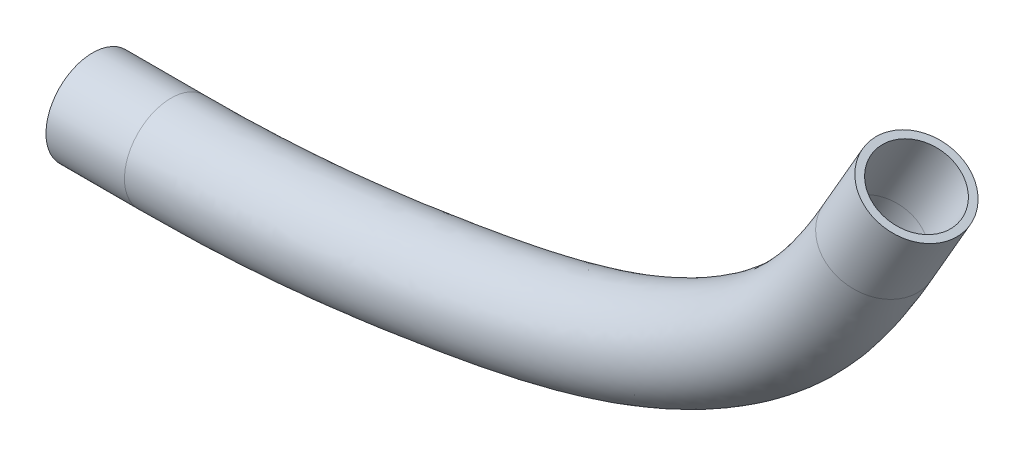
ISO-10303-21;
HEADER;
FILE_DESCRIPTION(('STEP AP214'),'2;1');
FILE_NAME('part.step','',(''),(''),'','','');
FILE_SCHEMA(('AUTOMOTIVE_DESIGN { 1 0 10303 214 1 1 1 1 }'));
ENDSEC;
DATA;
#1=APPLICATION_CONTEXT('core data for automotive mechanical design processes');
#2=APPLICATION_PROTOCOL_DEFINITION('international standard','automotive_design',2000,#1);
#3=PRODUCT_CONTEXT('',#1,'mechanical');
#4=PRODUCT('Part','Part','',(#3));
#5=PRODUCT_RELATED_PRODUCT_CATEGORY('part','',(#4));
#6=PRODUCT_DEFINITION_FORMATION('','',#4);
#7=PRODUCT_DEFINITION_CONTEXT('part definition',#1,'design');
#8=PRODUCT_DEFINITION('design','',#6,#7);
#9=PRODUCT_DEFINITION_SHAPE('','',#8);
#10=(LENGTH_UNIT() NAMED_UNIT(*) SI_UNIT(.MILLI.,.METRE.));
#11=(NAMED_UNIT(*) PLANE_ANGLE_UNIT() SI_UNIT($,.RADIAN.));
#12=(NAMED_UNIT(*) SI_UNIT($,.STERADIAN.) SOLID_ANGLE_UNIT());
#13=UNCERTAINTY_MEASURE_WITH_UNIT(LENGTH_MEASURE(1.E-05),#10,'distance_accuracy_value','');
#14=(GEOMETRIC_REPRESENTATION_CONTEXT(3) GLOBAL_UNCERTAINTY_ASSIGNED_CONTEXT((#13)) GLOBAL_UNIT_ASSIGNED_CONTEXT((#10,
#11,#12)) REPRESENTATION_CONTEXT('',''));
#15=CARTESIAN_POINT('',(0.,0.,0.));
#16=DIRECTION('',(0.,0.,1.));
#17=DIRECTION('',(1.,0.,0.));
#18=AXIS2_PLACEMENT_3D('',#15,#16,#17);
#19=CARTESIAN_POINT('',(228.6,88.9000000000001,0.));
#20=DIRECTION('',(0.500000000000005,0.866025403784436,0.));
#21=DIRECTION('',(-0.866025403784436,0.500000000000005,0.));
#22=AXIS2_PLACEMENT_3D('',#19,#20,#21);
#23=CYLINDRICAL_SURFACE('',#22,15.08125);
#24=CARTESIAN_POINT('',(228.6,88.9000000000001,0.));
#25=DIRECTION('',(-0.500000000000005,-0.866025403784436,0.));
#26=DIRECTION('',(0.866025403784436,-0.500000000000005,0.));
#27=AXIS2_PLACEMENT_3D('',#24,#25,#26);
#28=CIRCLE('',#27,15.08125);
#29=CARTESIAN_POINT('',(215.539254379176,96.4406250000001,0.));
#30=VERTEX_POINT('',#29);
#31=EDGE_CURVE('E99',#30,#30,#28,.T.);
#32=CARTESIAN_POINT('',(241.3,110.897045256125,0.));
#33=DIRECTION('',(-0.500000000000005,-0.866025403784436,0.));
#34=DIRECTION('',(0.866025403784436,-0.500000000000005,0.));
#35=AXIS2_PLACEMENT_3D('',#32,#33,#34);
#36=CIRCLE('',#35,15.08125);
#37=CARTESIAN_POINT('',(228.239254379176,118.437670256125,0.));
#38=VERTEX_POINT('',#37);
#39=EDGE_CURVE('E11',#38,#38,#36,.T.);
#40=CARTESIAN_POINT('',(215.539254379176,96.4406250000001,0.));
#41=CARTESIAN_POINT('',(215.671546045843,96.6697608880848,0.));
#42=CARTESIAN_POINT('',(215.803837712509,96.8988967761694,0.));
#43=CARTESIAN_POINT('',(216.068421045843,97.3571685523387,0.));
#44=CARTESIAN_POINT('',(216.200712712509,97.5863044404233,0.));
#45=CARTESIAN_POINT('',(216.465296045843,98.0445762165926,0.));
#46=CARTESIAN_POINT('',(216.597587712509,98.2737121046772,0.));
#47=CARTESIAN_POINT('',(216.862171045843,98.7319838808465,0.));
#48=CARTESIAN_POINT('',(216.994462712509,98.9611197689311,0.));
#49=CARTESIAN_POINT('',(217.259046045843,99.4193915451004,0.));
#50=CARTESIAN_POINT('',(217.391337712509,99.648527433185,0.));
#51=CARTESIAN_POINT('',(217.655921045843,100.106799209354,0.));
#52=CARTESIAN_POINT('',(217.788212712509,100.335935097439,0.));
#53=CARTESIAN_POINT('',(218.052796045843,100.794206873608,0.));
#54=CARTESIAN_POINT('',(218.185087712509,101.023342761693,0.));
#55=CARTESIAN_POINT('',(218.449671045843,101.481614537862,0.));
#56=CARTESIAN_POINT('',(218.581962712509,101.710750425947,0.));
#57=CARTESIAN_POINT('',(218.846546045843,102.169022202116,0.));
#58=CARTESIAN_POINT('',(218.978837712509,102.398158090201,0.));
#59=CARTESIAN_POINT('',(219.243421045843,102.85642986637,0.));
#60=CARTESIAN_POINT('',(219.375712712509,103.085565754454,0.));
#61=CARTESIAN_POINT('',(219.640296045843,103.543837530624,0.));
#62=CARTESIAN_POINT('',(219.772587712509,103.772973418708,0.));
#63=CARTESIAN_POINT('',(220.037171045843,104.231245194878,0.));
#64=CARTESIAN_POINT('',(220.169462712509,104.460381082962,0.));
#65=CARTESIAN_POINT('',(220.434046045843,104.918652859132,0.));
#66=CARTESIAN_POINT('',(220.566337712509,105.147788747216,0.));
#67=CARTESIAN_POINT('',(220.830921045843,105.606060523385,0.));
#68=CARTESIAN_POINT('',(220.963212712509,105.83519641147,0.));
#69=CARTESIAN_POINT('',(221.227796045843,106.293468187639,0.));
#70=CARTESIAN_POINT('',(221.360087712509,106.522604075724,0.));
#71=CARTESIAN_POINT('',(221.624671045843,106.980875851893,0.));
#72=CARTESIAN_POINT('',(221.756962712509,107.210011739978,0.));
#73=CARTESIAN_POINT('',(222.021546045843,107.668283516147,0.));
#74=CARTESIAN_POINT('',(222.153837712509,107.897419404232,0.));
#75=CARTESIAN_POINT('',(222.418421045843,108.355691180401,0.));
#76=CARTESIAN_POINT('',(222.550712712509,108.584827068486,0.));
#77=CARTESIAN_POINT('',(222.815296045843,109.043098844655,0.));
#78=CARTESIAN_POINT('',(222.947587712509,109.27223473274,0.));
#79=CARTESIAN_POINT('',(223.212171045843,109.730506508909,0.));
#80=CARTESIAN_POINT('',(223.344462712509,109.959642396993,0.));
#81=CARTESIAN_POINT('',(223.609046045843,110.417914173163,0.));
#82=CARTESIAN_POINT('',(223.741337712509,110.647050061247,0.));
#83=CARTESIAN_POINT('',(224.005921045843,111.105321837417,0.));
#84=CARTESIAN_POINT('',(224.138212712509,111.334457725501,0.));
#85=CARTESIAN_POINT('',(224.402796045843,111.79272950167,0.));
#86=CARTESIAN_POINT('',(224.535087712509,112.021865389755,0.));
#87=CARTESIAN_POINT('',(224.799671045843,112.480137165924,0.));
#88=CARTESIAN_POINT('',(224.931962712509,112.709273054009,0.));
#89=CARTESIAN_POINT('',(225.196546045843,113.167544830178,0.));
#90=CARTESIAN_POINT('',(225.328837712509,113.396680718263,0.));
#91=CARTESIAN_POINT('',(225.593421045843,113.854952494432,0.));
#92=CARTESIAN_POINT('',(225.725712712509,114.084088382517,0.));
#93=CARTESIAN_POINT('',(225.990296045843,114.542360158686,0.));
#94=CARTESIAN_POINT('',(226.122587712509,114.771496046771,0.));
#95=CARTESIAN_POINT('',(226.387171045843,115.22976782294,0.));
#96=CARTESIAN_POINT('',(226.519462712509,115.458903711025,0.));
#97=CARTESIAN_POINT('',(226.784046045843,115.917175487194,0.));
#98=CARTESIAN_POINT('',(226.916337712509,116.146311375278,0.));
#99=CARTESIAN_POINT('',(227.180921045843,116.604583151448,0.));
#100=CARTESIAN_POINT('',(227.313212712509,116.833719039532,0.));
#101=CARTESIAN_POINT('',(227.577796045843,117.291990815702,0.));
#102=CARTESIAN_POINT('',(227.710087712509,117.521126703786,0.));
#103=CARTESIAN_POINT('',(227.974671045843,117.979398479956,0.));
#104=CARTESIAN_POINT('',(228.106962712509,118.20853436804,0.));
#105=CARTESIAN_POINT('',(228.239254379176,118.437670256125,0.));
#106=B_SPLINE_CURVE_WITH_KNOTS('',3,(#40,#41,#42,#43,#44,#45,#46,#47,#48,#49,#50,#51,#52,#53,
#54,#55,#56,#57,#58,#59,#60,#61,#62,#63,#64,#65,#66,#67,#68,#69,#70,#71,#72,#73,#74,#75,#76,#77,
#78,#79,#80,#81,#82,#83,#84,#85,#86,#87,#88,#89,#90,#91,#92,#93,#94,#95,#96,#97,#98,#99,#100,
#101,#102,#103,#104,#105),.UNSPECIFIED.,.F.,.F.,(4,2,2,2,2,2,2,2,2,2,2,2,2,2,2,2,2,2,2,2,2,2,2,
2,2,2,2,2,2,2,2,2,4),(0.,0.79375,1.58750000000001,2.38125,3.17500000000001,3.96875,
4.76250000000001,5.55625,6.35000000000001,7.14375,7.93750000000002,8.73125,9.525,10.31875,
11.1125,11.90625,12.7,13.49375,14.2875,15.08125,15.875,16.66875,17.4625,18.25625,19.05,19.84375,
20.6375,21.43125,22.225,23.01875,23.8125,24.60625,25.4),.UNSPECIFIED.);
#107=EDGE_CURVE('BSEAM76',#30,#38,#106,.T.);
#108=ORIENTED_EDGE('',*,*,#31,.F.);
#109=ORIENTED_EDGE('',*,*,#39,.T.);
#110=ORIENTED_EDGE('',*,*,#107,.T.);
#111=ORIENTED_EDGE('',*,*,#107,.F.);
#112=EDGE_LOOP('',(#108,#110,#109,#111));
#113=FACE_BOUND('',#112,.T.);
#114=ADVANCED_FACE('F76',(#113),#23,.T.);
#115=CARTESIAN_POINT('',(228.6,88.9000000000001,0.));
#116=DIRECTION('',(0.500000000000005,0.866025403784436,0.));
#117=DIRECTION('',(-0.866025403784436,0.500000000000005,0.));
#118=AXIS2_PLACEMENT_3D('',#115,#116,#117);
#119=CYLINDRICAL_SURFACE('',#118,12.7);
#120=CARTESIAN_POINT('',(228.6,88.9000000000001,0.));
#121=DIRECTION('',(-0.500000000000005,-0.866025403784436,0.));
#122=DIRECTION('',(0.866025403784436,-0.500000000000005,0.));
#123=AXIS2_PLACEMENT_3D('',#120,#121,#122);
#124=CIRCLE('',#123,12.7);
#125=CARTESIAN_POINT('',(217.601477371938,95.2500000000001,0.));
#126=VERTEX_POINT('',#125);
#127=EDGE_CURVE('E102',#126,#126,#124,.T.);
#128=CARTESIAN_POINT('',(241.3,110.897045256125,0.));
#129=DIRECTION('',(-0.500000000000005,-0.866025403784436,0.));
#130=DIRECTION('',(0.866025403784436,-0.500000000000005,0.));
#131=AXIS2_PLACEMENT_3D('',#128,#129,#130);
#132=CIRCLE('',#131,12.7);
#133=CARTESIAN_POINT('',(230.301477371938,117.247045256125,0.));
#134=VERTEX_POINT('',#133);
#135=EDGE_CURVE('E82',#134,#134,#132,.T.);
#136=CARTESIAN_POINT('',(217.601477371938,95.2500000000001,0.));
#137=CARTESIAN_POINT('',(217.733769038604,95.4791358880848,0.));
#138=CARTESIAN_POINT('',(217.866060705271,95.7082717761694,0.));
#139=CARTESIAN_POINT('',(218.130644038604,96.1665435523387,0.));
#140=CARTESIAN_POINT('',(218.262935705271,96.3956794404233,0.));
#141=CARTESIAN_POINT('',(218.527519038604,96.8539512165926,0.));
#142=CARTESIAN_POINT('',(218.659810705271,97.0830871046772,0.));
#143=CARTESIAN_POINT('',(218.924394038604,97.5413588808464,0.));
#144=CARTESIAN_POINT('',(219.056685705271,97.7704947689311,0.));
#145=CARTESIAN_POINT('',(219.321269038604,98.2287665451004,0.));
#146=CARTESIAN_POINT('',(219.453560705271,98.457902433185,0.));
#147=CARTESIAN_POINT('',(219.718144038604,98.9161742093542,0.));
#148=CARTESIAN_POINT('',(219.850435705271,99.1453100974389,0.));
#149=CARTESIAN_POINT('',(220.115019038604,99.6035818736081,0.));
#150=CARTESIAN_POINT('',(220.247310705271,99.8327177616928,0.));
#151=CARTESIAN_POINT('',(220.511894038604,100.290989537862,0.));
#152=CARTESIAN_POINT('',(220.644185705271,100.520125425947,0.));
#153=CARTESIAN_POINT('',(220.908769038604,100.978397202116,0.));
#154=CARTESIAN_POINT('',(221.041060705271,101.207533090201,0.));
#155=CARTESIAN_POINT('',(221.305644038604,101.66580486637,0.));
#156=CARTESIAN_POINT('',(221.437935705271,101.894940754454,0.));
#157=CARTESIAN_POINT('',(221.702519038604,102.353212530624,0.));
#158=CARTESIAN_POINT('',(221.834810705271,102.582348418708,0.));
#159=CARTESIAN_POINT('',(222.099394038604,103.040620194878,0.));
#160=CARTESIAN_POINT('',(222.231685705271,103.269756082962,0.));
#161=CARTESIAN_POINT('',(222.496269038604,103.728027859132,0.));
#162=CARTESIAN_POINT('',(222.628560705271,103.957163747216,0.));
#163=CARTESIAN_POINT('',(222.893144038604,104.415435523385,0.));
#164=CARTESIAN_POINT('',(223.025435705271,104.64457141147,0.));
#165=CARTESIAN_POINT('',(223.290019038604,105.102843187639,0.));
#166=CARTESIAN_POINT('',(223.422310705271,105.331979075724,0.));
#167=CARTESIAN_POINT('',(223.686894038604,105.790250851893,0.));
#168=CARTESIAN_POINT('',(223.819185705271,106.019386739978,0.));
#169=CARTESIAN_POINT('',(224.083769038604,106.477658516147,0.));
#170=CARTESIAN_POINT('',(224.216060705271,106.706794404232,0.));
#171=CARTESIAN_POINT('',(224.480644038604,107.165066180401,0.));
#172=CARTESIAN_POINT('',(224.612935705271,107.394202068486,0.));
#173=CARTESIAN_POINT('',(224.877519038604,107.852473844655,0.));
#174=CARTESIAN_POINT('',(225.009810705271,108.08160973274,0.));
#175=CARTESIAN_POINT('',(225.274394038604,108.539881508909,0.));
#176=CARTESIAN_POINT('',(225.406685705271,108.769017396993,0.));
#177=CARTESIAN_POINT('',(225.671269038604,109.227289173163,0.));
#178=CARTESIAN_POINT('',(225.803560705271,109.456425061247,0.));
#179=CARTESIAN_POINT('',(226.068144038604,109.914696837417,0.));
#180=CARTESIAN_POINT('',(226.200435705271,110.143832725501,0.));
#181=CARTESIAN_POINT('',(226.465019038604,110.60210450167,0.));
#182=CARTESIAN_POINT('',(226.597310705271,110.831240389755,0.));
#183=CARTESIAN_POINT('',(226.861894038604,111.289512165924,0.));
#184=CARTESIAN_POINT('',(226.994185705271,111.518648054009,0.));
#185=CARTESIAN_POINT('',(227.258769038604,111.976919830178,0.));
#186=CARTESIAN_POINT('',(227.391060705271,112.206055718263,0.));
#187=CARTESIAN_POINT('',(227.655644038604,112.664327494432,0.));
#188=CARTESIAN_POINT('',(227.787935705271,112.893463382517,0.));
#189=CARTESIAN_POINT('',(228.052519038604,113.351735158686,0.));
#190=CARTESIAN_POINT('',(228.184810705271,113.580871046771,0.));
#191=CARTESIAN_POINT('',(228.449394038604,114.03914282294,0.));
#192=CARTESIAN_POINT('',(228.581685705271,114.268278711025,0.));
#193=CARTESIAN_POINT('',(228.846269038604,114.726550487194,0.));
#194=CARTESIAN_POINT('',(228.978560705271,114.955686375278,0.));
#195=CARTESIAN_POINT('',(229.243144038604,115.413958151448,0.));
#196=CARTESIAN_POINT('',(229.375435705271,115.643094039532,0.));
#197=CARTESIAN_POINT('',(229.640019038604,116.101365815702,0.));
#198=CARTESIAN_POINT('',(229.772310705271,116.330501703786,0.));
#199=CARTESIAN_POINT('',(230.036894038604,116.788773479956,0.));
#200=CARTESIAN_POINT('',(230.169185705271,117.01790936804,0.));
#201=CARTESIAN_POINT('',(230.301477371938,117.247045256125,0.));
#202=B_SPLINE_CURVE_WITH_KNOTS('',3,(#136,#137,#138,#139,#140,#141,#142,#143,#144,#145,#146,
#147,#148,#149,#150,#151,#152,#153,#154,#155,#156,#157,#158,#159,#160,#161,#162,#163,#164,#165,
#166,#167,#168,#169,#170,#171,#172,#173,#174,#175,#176,#177,#178,#179,#180,#181,#182,#183,#184,
#185,#186,#187,#188,#189,#190,#191,#192,#193,#194,#195,#196,#197,#198,#199,#200,#201),
.UNSPECIFIED.,.F.,.F.,(4,2,2,2,2,2,2,2,2,2,2,2,2,2,2,2,2,2,2,2,2,2,2,2,2,2,2,2,2,2,2,2,4),(0.,
0.793750000000013,1.58750000000001,2.38125000000001,3.17500000000001,3.96875000000002,
4.76250000000002,5.55625,6.35000000000002,7.14375,7.93750000000002,8.73125,9.52500000000002,
10.31875,11.1125,11.90625,12.7,13.49375,14.2875,15.08125,15.875,16.66875,17.4625,18.25625,19.05,
19.84375,20.6375,21.43125,22.225,23.01875,23.8125,24.60625,25.4),.UNSPECIFIED.);
#203=EDGE_CURVE('BSEAM120',#126,#134,#202,.T.);
#204=ORIENTED_EDGE('',*,*,#127,.T.);
#205=ORIENTED_EDGE('',*,*,#135,.F.);
#206=ORIENTED_EDGE('',*,*,#203,.T.);
#207=ORIENTED_EDGE('',*,*,#203,.F.);
#208=EDGE_LOOP('',(#204,#206,#205,#207));
#209=FACE_BOUND('',#208,.T.);
#210=ADVANCED_FACE('F120',(#209),#119,.F.);
#211=CARTESIAN_POINT('',(0.,0.,0.));
#212=DIRECTION('',(-1.,0.,0.));
#213=DIRECTION('',(0.,-1.,0.));
#214=AXIS2_PLACEMENT_3D('',#211,#212,#213);
#215=CYLINDRICAL_SURFACE('',#214,12.7);
#216=CARTESIAN_POINT('',(0.,0.,0.));
#217=DIRECTION('',(-1.,0.,0.));
#218=DIRECTION('',(0.,-1.,0.));
#219=AXIS2_PLACEMENT_3D('',#216,#217,#218);
#220=CIRCLE('',#219,12.7);
#221=CARTESIAN_POINT('',(0.,-12.7,0.));
#222=VERTEX_POINT('',#221);
#223=EDGE_CURVE('E86',#222,#222,#220,.T.);
#224=ORIENTED_EDGE('',*,*,#223,.F.);
#225=EDGE_LOOP('',(#224));
#226=FACE_BOUND('',#225,.T.);
#227=CARTESIAN_POINT('',(-25.4,0.,0.));
#228=DIRECTION('',(-1.,0.,0.));
#229=DIRECTION('',(0.,-1.,0.));
#230=AXIS2_PLACEMENT_3D('',#227,#228,#229);
#231=CIRCLE('',#230,12.7);
#232=CARTESIAN_POINT('',(-25.4,-12.7,0.));
#233=VERTEX_POINT('',#232);
#234=EDGE_CURVE('E95',#233,#233,#231,.T.);
#235=ORIENTED_EDGE('',*,*,#234,.T.);
#236=EDGE_LOOP('',(#235));
#237=FACE_BOUND('',#236,.T.);
#238=ADVANCED_FACE('F124',(#226,#237),#215,.F.);
#239=CARTESIAN_POINT('',(0.,0.,0.));
#240=DIRECTION('',(-1.,0.,0.));
#241=DIRECTION('',(0.,-1.,0.));
#242=AXIS2_PLACEMENT_3D('',#239,#240,#241);
#243=CYLINDRICAL_SURFACE('',#242,15.08125);
#244=CARTESIAN_POINT('',(0.,0.,0.));
#245=DIRECTION('',(-1.,0.,0.));
#246=DIRECTION('',(0.,-1.,0.));
#247=AXIS2_PLACEMENT_3D('',#244,#245,#246);
#248=CIRCLE('',#247,15.08125);
#249=CARTESIAN_POINT('',(0.,-15.08125,0.));
#250=VERTEX_POINT('',#249);
#251=EDGE_CURVE('E97',#250,#250,#248,.T.);
#252=ORIENTED_EDGE('',*,*,#251,.T.);
#253=EDGE_LOOP('',(#252));
#254=FACE_BOUND('',#253,.T.);
#255=CARTESIAN_POINT('',(-25.4,0.,0.));
#256=DIRECTION('',(-1.,0.,0.));
#257=DIRECTION('',(0.,-1.,0.));
#258=AXIS2_PLACEMENT_3D('',#255,#256,#257);
#259=CIRCLE('',#258,15.08125);
#260=CARTESIAN_POINT('',(-25.4,-15.08125,0.));
#261=VERTEX_POINT('',#260);
#262=EDGE_CURVE('E90',#261,#261,#259,.T.);
#263=ORIENTED_EDGE('',*,*,#262,.F.);
#264=EDGE_LOOP('',(#263));
#265=FACE_BOUND('',#264,.T.);
#266=ADVANCED_FACE('F108',(#254,#265),#243,.T.);
#267=CARTESIAN_POINT('',(-25.4,0.,0.));
#268=DIRECTION('',(-1.,0.,0.));
#269=DIRECTION('',(0.,-1.,0.));
#270=AXIS2_PLACEMENT_3D('',#267,#268,#269);
#271=PLANE('',#270);
#272=ORIENTED_EDGE('',*,*,#234,.F.);
#273=EDGE_LOOP('',(#272));
#274=FACE_BOUND('',#273,.T.);
#275=ORIENTED_EDGE('',*,*,#262,.T.);
#276=EDGE_LOOP('',(#275));
#277=FACE_BOUND('',#276,.T.);
#278=ADVANCED_FACE('F135',(#274,#277),#271,.T.);
#279=CARTESIAN_POINT('',(241.3,110.897045256125,0.));
#280=DIRECTION('',(-0.500000000000005,-0.866025403784436,0.));
#281=DIRECTION('',(0.866025403784436,-0.500000000000005,0.));
#282=AXIS2_PLACEMENT_3D('',#279,#280,#281);
#283=PLANE('',#282);
#284=ORIENTED_EDGE('',*,*,#135,.T.);
#285=EDGE_LOOP('',(#284));
#286=FACE_BOUND('',#285,.T.);
#287=ORIENTED_EDGE('',*,*,#39,.F.);
#288=EDGE_LOOP('',(#287));
#289=FACE_BOUND('',#288,.T.);
#290=ADVANCED_FACE('F115',(#286,#289),#283,.F.);
#291=CARTESIAN_POINT('',(0.,-15.08125,0.));
#292=CARTESIAN_POINT('',(18.093431211147,-15.08125,0.));
#293=CARTESIAN_POINT('',(49.9392420784111,-13.3944278860965,0.));
#294=CARTESIAN_POINT('',(80.0631694084453,-9.14945539964788,0.));
#295=CARTESIAN_POINT('',(111.578090255299,-3.90013932534059,0.));
#296=CARTESIAN_POINT('',(133.879045836862,0.651919121229525,0.));
#297=CARTESIAN_POINT('',(160.096131982639,9.95020346990676,0.));
#298=CARTESIAN_POINT('',(179.330164217016,18.4436051873841,0.));
#299=CARTESIAN_POINT('',(196.44367233351,28.972441116401,0.));
#300=CARTESIAN_POINT('',(212.26941229311,41.9785559995121,0.));
#301=CARTESIAN_POINT('',(226.168861768673,56.4789919037061,0.));
#302=CARTESIAN_POINT('',(236.246260228094,71.9812112029525,0.));
#303=CARTESIAN_POINT('',(241.660745620824,81.359375,0.));
#304=CARTESIAN_POINT('',(0.,-15.08125,-30.1625));
#305=CARTESIAN_POINT('',(16.6150789725271,-15.08125,-30.1625));
#306=CARTESIAN_POINT('',(50.4847528081656,-13.3915701600589,-30.1625));
#307=CARTESIAN_POINT('',(80.2027217505945,-9.15496845130661,-30.1625));
#308=CARTESIAN_POINT('',(111.46516577559,-3.89624547701228,-30.1625));
#309=CARTESIAN_POINT('',(133.891308604068,0.678515969095929,-30.1625));
#310=CARTESIAN_POINT('',(160.09160522909,9.92662890568883,-30.1625));
#311=CARTESIAN_POINT('',(179.309061748697,18.4154952854764,-30.1625));
#312=CARTESIAN_POINT('',(196.547852260839,29.1532274254173,-30.1625));
#313=CARTESIAN_POINT('',(212.116756483925,41.7129369425094,-30.1625));
#314=CARTESIAN_POINT('',(225.859085412365,55.9431036139135,-30.1625));
#315=CARTESIAN_POINT('',(237.450326235699,74.0667147037901,-30.1625));
#316=CARTESIAN_POINT('',(241.660745620824,81.359375,-30.1625));
#317=CARTESIAN_POINT('',(0.,15.08125,-30.1625));
#318=CARTESIAN_POINT('',(16.6150789725271,15.08125,-30.1625));
#319=CARTESIAN_POINT('',(46.9604612473906,16.6337705522859,-30.1625));
#320=CARTESIAN_POINT('',(75.9703848872865,20.7308081432165,-30.1625));
#321=CARTESIAN_POINT('',(105.747901194065,25.7186906801474,-30.1625));
#322=CARTESIAN_POINT('',(126.297699937763,29.9947924752805,-30.1625));
#323=CARTESIAN_POINT('',(148.930843491576,37.9677630901454,-30.1625));
#324=CARTESIAN_POINT('',(165.155415435041,45.1627919177847,-30.1625));
#325=CARTESIAN_POINT('',(179.360235967597,54.0724592636084,-30.1625));
#326=CARTESIAN_POINT('',(191.509787197597,63.822161698121,-30.1625));
#327=CARTESIAN_POINT('',(201.848149407904,74.6156698462572,-30.1625));
#328=CARTESIAN_POINT('',(211.328834994051,89.1479647037903,-30.1625));
#329=CARTESIAN_POINT('',(215.539254379176,96.4406250000001,-30.1625));
#330=CARTESIAN_POINT('',(0.,15.08125,0.));
#331=CARTESIAN_POINT('',(17.3542550918371,15.08125,0.));
#332=CARTESIAN_POINT('',(46.6877058825133,16.6323416892671,0.));
#333=CARTESIAN_POINT('',(75.9006087162119,20.7335646690459,0.));
#334=CARTESIAN_POINT('',(105.804363433919,25.7167437559832,0.));
#335=CARTESIAN_POINT('',(126.29156855416,29.9814940513473,0.));
#336=CARTESIAN_POINT('',(148.933106868351,37.9795503722544,0.));
#337=CARTESIAN_POINT('',(165.165966669201,45.1768468687386,0.));
#338=CARTESIAN_POINT('',(179.308146003932,53.9820661091003,0.));
#339=CARTESIAN_POINT('',(191.58611510219,63.9549712266223,0.));
#340=CARTESIAN_POINT('',(202.003037586058,74.8836139911535,0.));
#341=CARTESIAN_POINT('',(210.726801990248,88.1052129533714,0.));
#342=CARTESIAN_POINT('',(215.539254379176,96.4406250000001,0.));
#343=CARTESIAN_POINT('',(0.,15.08125,30.1625));
#344=CARTESIAN_POINT('',(18.093431211147,15.08125,30.1625));
#345=CARTESIAN_POINT('',(46.4149505176361,16.6309128262484,30.1625));
#346=CARTESIAN_POINT('',(75.8308325451373,20.7363211948753,30.1625));
#347=CARTESIAN_POINT('',(105.860825673773,25.7147968318191,30.1625));
#348=CARTESIAN_POINT('',(126.285437170558,29.9681956274141,30.1625));
#349=CARTESIAN_POINT('',(148.935370245125,37.9913376543634,30.1625));
#350=CARTESIAN_POINT('',(165.176517903361,45.1909018196924,30.1625));
#351=CARTESIAN_POINT('',(179.256056040268,53.8916729545922,30.1625));
#352=CARTESIAN_POINT('',(191.662443006782,64.0877807551237,30.1625));
#353=CARTESIAN_POINT('',(202.157925764212,75.1515581360498,30.1625));
#354=CARTESIAN_POINT('',(210.124768986446,87.0624612029527,30.1625));
#355=CARTESIAN_POINT('',(215.539254379176,96.4406250000001,30.1625));
#356=CARTESIAN_POINT('',(0.,-15.08125,30.1625));
#357=CARTESIAN_POINT('',(19.5717834497669,-15.08125,30.1625));
#358=CARTESIAN_POINT('',(49.3937313486567,-13.397285612134,30.1625));
#359=CARTESIAN_POINT('',(79.9236170662962,-9.14394234798914,30.1625));
#360=CARTESIAN_POINT('',(111.691014735007,-3.90403317366889,30.1625));
#361=CARTESIAN_POINT('',(133.866783069657,0.625322273363133,30.1625));
#362=CARTESIAN_POINT('',(160.100658736188,9.9737780341247,30.1625));
#363=CARTESIAN_POINT('',(179.351266685336,18.4717150892918,30.1625));
#364=CARTESIAN_POINT('',(196.339492406181,28.7916548073848,30.1625));
#365=CARTESIAN_POINT('',(212.422068102295,42.2441750565147,30.1625));
#366=CARTESIAN_POINT('',(226.478638124981,57.0148801934986,30.1625));
#367=CARTESIAN_POINT('',(235.04219422049,69.8957077021149,30.1625));
#368=CARTESIAN_POINT('',(241.660745620824,81.359375,30.1625));
#369=CARTESIAN_POINT('',(0.,-15.08125,0.));
#370=CARTESIAN_POINT('',(18.093431211147,-15.08125,0.));
#371=CARTESIAN_POINT('',(49.9392420784111,-13.3944278860965,0.));
#372=CARTESIAN_POINT('',(80.0631694084453,-9.14945539964788,0.));
#373=CARTESIAN_POINT('',(111.578090255299,-3.90013932534059,0.));
#374=CARTESIAN_POINT('',(133.879045836862,0.651919121229525,0.));
#375=CARTESIAN_POINT('',(160.096131982639,9.95020346990676,0.));
#376=CARTESIAN_POINT('',(179.330164217016,18.4436051873841,0.));
#377=CARTESIAN_POINT('',(196.44367233351,28.972441116401,0.));
#378=CARTESIAN_POINT('',(212.26941229311,41.9785559995121,0.));
#379=CARTESIAN_POINT('',(226.168861768673,56.4789919037061,0.));
#380=CARTESIAN_POINT('',(236.246260228094,71.9812112029525,0.));
#381=CARTESIAN_POINT('',(241.660745620824,81.359375,0.));
#382=(BOUNDED_SURFACE() B_SPLINE_SURFACE(3,3,((#291,#292,#293,#294,#295,#296,#297,#298,#299,
#300,#301,#302,#303),(#304,#305,#306,#307,#308,#309,#310,#311,#312,#313,#314,#315,#316),(#317,
#318,#319,#320,#321,#322,#323,#324,#325,#326,#327,#328,#329),(#330,#331,#332,#333,#334,#335,
#336,#337,#338,#339,#340,#341,#342),(#343,#344,#345,#346,#347,#348,#349,#350,#351,#352,#353,
#354,#355),(#356,#357,#358,#359,#360,#361,#362,#363,#364,#365,#366,#367,#368),(#369,#370,#371,
#372,#373,#374,#375,#376,#377,#378,#379,#380,#381)),.UNSPECIFIED.,.T.,.F.,
.F.) B_SPLINE_SURFACE_WITH_KNOTS((4,3,4),(4,1,1,1,1,1,1,1,1,1,4),(0.,0.5,1.),(0.,
0.186666666666667,0.348640621046122,0.373333333333337,0.56,0.600436112688898,0.67,0.78,
0.811119742450717,0.89,1.),
.UNSPECIFIED.) GEOMETRIC_REPRESENTATION_ITEM() RATIONAL_B_SPLINE_SURFACE(((1.,1.,1.,1.,1.,1.,1.,
1.,1.,1.,1.,1.,1.),(0.333333333333333,0.333333333333333,0.333333333333333,0.333333333333333,
0.333333333333333,0.333333333333333,0.333333333333333,0.333333333333333,0.333333333333333,
0.333333333333333,0.333333333333333,0.333333333333333,0.333333333333333),(0.333333333333333,
0.333333333333333,0.333333333333333,0.333333333333333,0.333333333333333,0.333333333333333,
0.333333333333333,0.333333333333333,0.333333333333333,0.333333333333333,0.333333333333333,
0.333333333333333,0.333333333333333),(1.,1.,1.,1.,1.,1.,1.,1.,1.,1.,1.,1.,1.),
(0.333333333333333,0.333333333333333,0.333333333333333,0.333333333333333,0.333333333333333,
0.333333333333333,0.333333333333333,0.333333333333333,0.333333333333333,0.333333333333333,
0.333333333333333,0.333333333333333,0.333333333333333),(0.333333333333333,0.333333333333333,
0.333333333333333,0.333333333333333,0.333333333333333,0.333333333333333,0.333333333333333,
0.333333333333333,0.333333333333333,0.333333333333333,0.333333333333333,0.333333333333333,
0.333333333333333),(1.,1.,1.,1.,1.,1.,1.,1.,1.,1.,1.,1.,1.))) REPRESENTATION_ITEM('') SURFACE());
#383=ORIENTED_EDGE('',*,*,#251,.F.);
#384=EDGE_LOOP('',(#383));
#385=FACE_BOUND('',#384,.T.);
#386=ORIENTED_EDGE('',*,*,#31,.T.);
#387=EDGE_LOOP('',(#386));
#388=FACE_BOUND('',#387,.T.);
#389=ADVANCED_FACE('F111',(#385,#388),#382,.T.);
#390=CARTESIAN_POINT('',(0.,-12.7,0.));
#391=CARTESIAN_POINT('',(18.0934312090011,-12.7,0.));
#392=CARTESIAN_POINT('',(49.6610085358262,-11.0240062493571,0.));
#393=CARTESIAN_POINT('',(79.7290375492918,-6.79005198728915,0.));
#394=CARTESIAN_POINT('',(111.126727263076,-1.56211804765762,0.));
#395=CARTESIAN_POINT('',(133.279550424185,2.96636201776183,0.));
#396=CARTESIAN_POINT('',(159.215019206499,12.1639772084898,0.));
#397=CARTESIAN_POINT('',(178.212771078157,20.5552338535941,0.));
#398=CARTESIAN_POINT('',(195.086755314495,30.9397489914237,0.));
#399=CARTESIAN_POINT('',(210.642546213417,43.7240209673362,0.));
#400=CARTESIAN_POINT('',(224.273261389525,57.9531415779664,0.));
#401=CARTESIAN_POINT('',(234.184037890182,73.1718373371855,0.));
#402=CARTESIAN_POINT('',(239.598522628062,82.55,0.));
#403=CARTESIAN_POINT('',(0.,-12.7,-25.4));
#404=CARTESIAN_POINT('',(16.8485030078968,-12.7,-25.4));
#405=CARTESIAN_POINT('',(50.1203859927064,-11.0215997428989,-25.4));
#406=CARTESIAN_POINT('',(79.8465553107593,-6.79469455772703,-25.4));
#407=CARTESIAN_POINT('',(111.031632964614,-1.55883901704852,-25.4));
#408=CARTESIAN_POINT('',(133.289876966716,2.98875936632463,-25.4));
#409=CARTESIAN_POINT('',(159.211207201981,12.1441249412341,-25.4));
#410=CARTESIAN_POINT('',(178.195000576694,20.5315623540895,-25.4));
#411=CARTESIAN_POINT('',(195.174485791352,31.0919901140845,-25.4));
#412=CARTESIAN_POINT('',(210.513993935804,43.5003417315675,-25.4));
#413=CARTESIAN_POINT('',(224.012397054681,57.501867168401,-25.4));
#414=CARTESIAN_POINT('',(235.197988347785,74.9280510461121,-25.4));
#415=CARTESIAN_POINT('',(239.598522628062,82.55,-25.4));
#416=CARTESIAN_POINT('',(0.,12.7,-25.4));
#417=CARTESIAN_POINT('',(16.8485030078968,12.7,-25.4));
#418=CARTESIAN_POINT('',(47.1525615204748,14.2628976990757,-25.4));
#419=CARTESIAN_POINT('',(76.2824821627104,18.3722752060819,-25.4));
#420=CARTESIAN_POINT('',(106.217094369645,23.3800545889807,-25.4));
#421=CARTESIAN_POINT('',(126.89525914246,27.6761501083748,-25.4));
#422=CARTESIAN_POINT('',(149.812671001969,35.7577116228817,-25.4));
#423=CARTESIAN_POINT('',(166.276140523089,43.0556016234018,-25.4));
#424=CARTESIAN_POINT('',(180.700703649674,52.0766063988771,-25.4));
#425=CARTESIAN_POINT('',(193.160756642055,62.1186362626089,-25.4));
#426=CARTESIAN_POINT('',(203.792661471977,73.2261334693221,-25.4));
#427=CARTESIAN_POINT('',(213.200943091661,87.6280510461123,-25.4));
#428=CARTESIAN_POINT('',(217.601477371938,95.2500000000001,-25.4));
#429=CARTESIAN_POINT('',(0.,12.7,0.));
#430=CARTESIAN_POINT('',(17.470967108449,12.7,0.));
#431=CARTESIAN_POINT('',(46.9228727920347,14.2616944458466,0.));
#432=CARTESIAN_POINT('',(76.2237232819767,18.3745964913009,0.));
#433=CARTESIAN_POINT('',(106.264641518876,23.3784150736761,0.));
#434=CARTESIAN_POINT('',(126.890095871194,27.6649514340934,0.));
#435=CARTESIAN_POINT('',(149.814577004228,35.7676377565096,0.));
#436=CARTESIAN_POINT('',(166.285025773821,43.0674373731541,0.));
#437=CARTESIAN_POINT('',(180.656838411246,52.0004858375467,0.));
#438=CARTESIAN_POINT('',(193.225032780861,62.2304758804932,0.));
#439=CARTESIAN_POINT('',(203.923093639399,73.4517706741048,0.));
#440=CARTESIAN_POINT('',(212.693967862859,86.7499441916489,0.));
#441=CARTESIAN_POINT('',(217.601477371938,95.2500000000001,0.));
#442=CARTESIAN_POINT('',(0.,12.7,25.4));
#443=CARTESIAN_POINT('',(18.0934312090011,12.7,25.4));
#444=CARTESIAN_POINT('',(46.6931840635946,14.2604911926175,25.4));
#445=CARTESIAN_POINT('',(76.164964401243,18.3769177765198,25.4));
#446=CARTESIAN_POINT('',(106.312188668107,23.3767755583715,25.4));
#447=CARTESIAN_POINT('',(126.884932599929,27.653752759812,25.4));
#448=CARTESIAN_POINT('',(149.816483006487,35.7775638901375,25.4));
#449=CARTESIAN_POINT('',(166.293911024553,43.0792731229064,25.4));
#450=CARTESIAN_POINT('',(180.612973172817,51.9243652762163,25.4));
#451=CARTESIAN_POINT('',(193.289308919668,62.3423154983775,25.4));
#452=CARTESIAN_POINT('',(204.053525806821,73.6774078788874,25.4));
#453=CARTESIAN_POINT('',(212.186992634058,85.8718373371857,25.4));
#454=CARTESIAN_POINT('',(217.601477371938,95.2500000000001,25.4));
#455=CARTESIAN_POINT('',(0.,-12.7,25.4));
#456=CARTESIAN_POINT('',(19.3383594101054,-12.7,25.4));
#457=CARTESIAN_POINT('',(49.201631078946,-11.0264127558154,25.4));
#458=CARTESIAN_POINT('',(79.6115197878244,-6.78540941685126,25.4));
#459=CARTESIAN_POINT('',(111.221821561537,-1.56539707826673,25.4));
#460=CARTESIAN_POINT('',(133.269223881654,2.94396466919903,25.4));
#461=CARTESIAN_POINT('',(159.218831211017,12.1838294757456,25.4));
#462=CARTESIAN_POINT('',(178.230541579621,20.5789053530987,25.4));
#463=CARTESIAN_POINT('',(194.999024837637,30.7875078687629,25.4));
#464=CARTESIAN_POINT('',(210.77109849103,43.9477002031048,25.4));
#465=CARTESIAN_POINT('',(224.534125724368,58.4044159875317,25.4));
#466=CARTESIAN_POINT('',(233.170087432579,71.4156236282588,25.4));
#467=CARTESIAN_POINT('',(239.598522628062,82.55,25.4));
#468=CARTESIAN_POINT('',(0.,-12.7,0.));
#469=CARTESIAN_POINT('',(18.0934312090011,-12.7,0.));
#470=CARTESIAN_POINT('',(49.6610085358262,-11.0240062493571,0.));
#471=CARTESIAN_POINT('',(79.7290375492918,-6.79005198728915,0.));
#472=CARTESIAN_POINT('',(111.126727263076,-1.56211804765762,0.));
#473=CARTESIAN_POINT('',(133.279550424185,2.96636201776183,0.));
#474=CARTESIAN_POINT('',(159.215019206499,12.1639772084898,0.));
#475=CARTESIAN_POINT('',(178.212771078157,20.5552338535941,0.));
#476=CARTESIAN_POINT('',(195.086755314495,30.9397489914237,0.));
#477=CARTESIAN_POINT('',(210.642546213417,43.7240209673362,0.));
#478=CARTESIAN_POINT('',(224.273261389525,57.9531415779664,0.));
#479=CARTESIAN_POINT('',(234.184037890182,73.1718373371855,0.));
#480=CARTESIAN_POINT('',(239.598522628062,82.55,0.));
#481=(BOUNDED_SURFACE() B_SPLINE_SURFACE(3,3,((#390,#391,#392,#393,#394,#395,#396,#397,#398,
#399,#400,#401,#402),(#403,#404,#405,#406,#407,#408,#409,#410,#411,#412,#413,#414,#415),(#416,
#417,#418,#419,#420,#421,#422,#423,#424,#425,#426,#427,#428),(#429,#430,#431,#432,#433,#434,
#435,#436,#437,#438,#439,#440,#441),(#442,#443,#444,#445,#446,#447,#448,#449,#450,#451,#452,
#453,#454),(#455,#456,#457,#458,#459,#460,#461,#462,#463,#464,#465,#466,#467),(#468,#469,#470,
#471,#472,#473,#474,#475,#476,#477,#478,#479,#480)),.UNSPECIFIED.,.T.,.F.,
.F.) B_SPLINE_SURFACE_WITH_KNOTS((4,3,4),(4,1,1,1,1,1,1,1,1,1,4),(0.,0.5,1.),(0.,
0.186666666666667,0.348640621046122,0.373333333333337,0.56,0.600436112688898,0.67,0.78,
0.811119742450717,0.89,1.),
.UNSPECIFIED.) GEOMETRIC_REPRESENTATION_ITEM() RATIONAL_B_SPLINE_SURFACE(((1.,1.,1.,1.,1.,1.,1.,
1.,1.,1.,1.,1.,1.),(0.333333333333333,0.333333333333333,0.333333333333333,0.333333333333333,
0.333333333333333,0.333333333333333,0.333333333333333,0.333333333333333,0.333333333333333,
0.333333333333333,0.333333333333333,0.333333333333333,0.333333333333333),(0.333333333333333,
0.333333333333333,0.333333333333333,0.333333333333333,0.333333333333333,0.333333333333333,
0.333333333333333,0.333333333333333,0.333333333333333,0.333333333333333,0.333333333333333,
0.333333333333333,0.333333333333333),(1.,1.,1.,1.,1.,1.,1.,1.,1.,1.,1.,1.,1.),
(0.333333333333333,0.333333333333333,0.333333333333333,0.333333333333333,0.333333333333333,
0.333333333333333,0.333333333333333,0.333333333333333,0.333333333333333,0.333333333333333,
0.333333333333333,0.333333333333333,0.333333333333333),(0.333333333333333,0.333333333333333,
0.333333333333333,0.333333333333333,0.333333333333333,0.333333333333333,0.333333333333333,
0.333333333333333,0.333333333333333,0.333333333333333,0.333333333333333,0.333333333333333,
0.333333333333333),(1.,1.,1.,1.,1.,1.,1.,1.,1.,1.,1.,1.,1.))) REPRESENTATION_ITEM('') SURFACE());
#482=ORIENTED_EDGE('',*,*,#223,.T.);
#483=EDGE_LOOP('',(#482));
#484=FACE_BOUND('',#483,.T.);
#485=ORIENTED_EDGE('',*,*,#127,.F.);
#486=EDGE_LOOP('',(#485));
#487=FACE_BOUND('',#486,.T.);
#488=ADVANCED_FACE('F114',(#484,#487),#481,.F.);
#489=CLOSED_SHELL('',(#114,#210,#238,#266,#278,#290,#389,#488));
#490=MANIFOLD_SOLID_BREP('B2',#489);
#491=ADVANCED_BREP_SHAPE_REPRESENTATION('',(#18,#490),#14);
#492=SHAPE_DEFINITION_REPRESENTATION(#9,#491);
ENDSEC;
END-ISO-10303-21;
